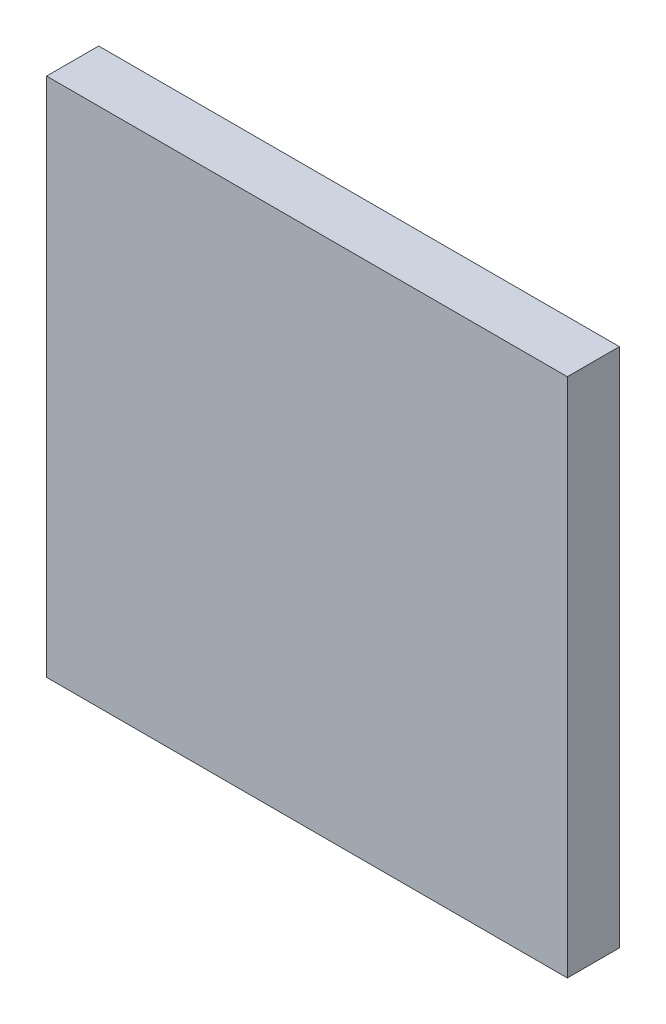
ISO-10303-21;
HEADER;
FILE_DESCRIPTION(('STEP AP214'),'2;1');
FILE_NAME('part.step','',(''),(''),'','','');
FILE_SCHEMA(('AUTOMOTIVE_DESIGN { 1 0 10303 214 1 1 1 1 }'));
ENDSEC;
DATA;
#1=APPLICATION_CONTEXT('core data for automotive mechanical design processes');
#2=APPLICATION_PROTOCOL_DEFINITION('international standard','automotive_design',2000,#1);
#3=PRODUCT_CONTEXT('',#1,'mechanical');
#4=PRODUCT('Part','Part','',(#3));
#5=PRODUCT_RELATED_PRODUCT_CATEGORY('part','',(#4));
#6=PRODUCT_DEFINITION_FORMATION('','',#4);
#7=PRODUCT_DEFINITION_CONTEXT('part definition',#1,'design');
#8=PRODUCT_DEFINITION('design','',#6,#7);
#9=PRODUCT_DEFINITION_SHAPE('','',#8);
#10=(LENGTH_UNIT() NAMED_UNIT(*) SI_UNIT(.MILLI.,.METRE.));
#11=(NAMED_UNIT(*) PLANE_ANGLE_UNIT() SI_UNIT($,.RADIAN.));
#12=(NAMED_UNIT(*) SI_UNIT($,.STERADIAN.) SOLID_ANGLE_UNIT());
#13=UNCERTAINTY_MEASURE_WITH_UNIT(LENGTH_MEASURE(1.E-05),#10,'distance_accuracy_value','');
#14=(GEOMETRIC_REPRESENTATION_CONTEXT(3) GLOBAL_UNCERTAINTY_ASSIGNED_CONTEXT((#13)) GLOBAL_UNIT_ASSIGNED_CONTEXT((#10,
#11,#12)) REPRESENTATION_CONTEXT('',''));
#15=CARTESIAN_POINT('',(0.,0.,0.));
#16=DIRECTION('',(0.,0.,1.));
#17=DIRECTION('',(1.,0.,0.));
#18=AXIS2_PLACEMENT_3D('',#15,#16,#17);
#19=CARTESIAN_POINT('',(0.,0.,10.));
#20=DIRECTION('',(1.,0.,0.));
#21=DIRECTION('',(0.,0.,-1.));
#22=AXIS2_PLACEMENT_3D('',#19,#20,#21);
#23=PLANE('',#22);
#24=DIRECTION('',(0.,-1.,0.));
#25=VECTOR('',#24,1.);
#26=CARTESIAN_POINT('',(0.,0.,0.));
#27=LINE('',#26,#25);
#28=CARTESIAN_POINT('',(0.,100.,0.));
#29=VERTEX_POINT('',#28);
#30=CARTESIAN_POINT('',(0.,0.,0.));
#31=VERTEX_POINT('',#30);
#32=EDGE_CURVE('E100',#29,#31,#27,.T.);
#33=ORIENTED_EDGE('',*,*,#32,.T.);
#34=DIRECTION('',(0.,0.,-1.));
#35=VECTOR('',#34,1.);
#36=CARTESIAN_POINT('',(0.,0.,10.));
#37=LINE('',#36,#35);
#38=CARTESIAN_POINT('',(0.,0.,10.));
#39=VERTEX_POINT('',#38);
#40=EDGE_CURVE('E11',#39,#31,#37,.T.);
#41=ORIENTED_EDGE('',*,*,#40,.F.);
#42=DIRECTION('',(0.,-1.,0.));
#43=VECTOR('',#42,1.);
#44=CARTESIAN_POINT('',(0.,0.,10.));
#45=LINE('',#44,#43);
#46=CARTESIAN_POINT('',(0.,100.,10.));
#47=VERTEX_POINT('',#46);
#48=EDGE_CURVE('E88',#47,#39,#45,.T.);
#49=ORIENTED_EDGE('',*,*,#48,.F.);
#50=DIRECTION('',(0.,0.,-1.));
#51=VECTOR('',#50,1.);
#52=CARTESIAN_POINT('',(0.,100.,10.));
#53=LINE('',#52,#51);
#54=EDGE_CURVE('E96',#47,#29,#53,.T.);
#55=ORIENTED_EDGE('',*,*,#54,.T.);
#56=EDGE_LOOP('',(#33,#41,#49,#55));
#57=FACE_BOUND('',#56,.T.);
#58=ADVANCED_FACE('F37',(#57),#23,.F.);
#59=CARTESIAN_POINT('',(0.,0.,10.));
#60=DIRECTION('',(0.,1.,0.));
#61=DIRECTION('',(0.,0.,1.));
#62=AXIS2_PLACEMENT_3D('',#59,#60,#61);
#63=PLANE('',#62);
#64=DIRECTION('',(1.,0.,0.));
#65=VECTOR('',#64,1.);
#66=CARTESIAN_POINT('',(0.,0.,0.));
#67=LINE('',#66,#65);
#68=CARTESIAN_POINT('',(100.,0.,0.));
#69=VERTEX_POINT('',#68);
#70=EDGE_CURVE('E92',#31,#69,#67,.T.);
#71=ORIENTED_EDGE('',*,*,#70,.T.);
#72=DIRECTION('',(0.,0.,-1.));
#73=VECTOR('',#72,1.);
#74=CARTESIAN_POINT('',(100.,0.,10.));
#75=LINE('',#74,#73);
#76=CARTESIAN_POINT('',(100.,0.,10.));
#77=VERTEX_POINT('',#76);
#78=EDGE_CURVE('E45',#77,#69,#75,.T.);
#79=ORIENTED_EDGE('',*,*,#78,.F.);
#80=DIRECTION('',(1.,0.,0.));
#81=VECTOR('',#80,1.);
#82=CARTESIAN_POINT('',(0.,0.,10.));
#83=LINE('',#82,#81);
#84=EDGE_CURVE('E83',#39,#77,#83,.T.);
#85=ORIENTED_EDGE('',*,*,#84,.F.);
#86=ORIENTED_EDGE('',*,*,#40,.T.);
#87=EDGE_LOOP('',(#71,#79,#85,#86));
#88=FACE_BOUND('',#87,.T.);
#89=ADVANCED_FACE('F91',(#88),#63,.F.);
#90=CARTESIAN_POINT('',(100.,0.,10.));
#91=DIRECTION('',(-1.,0.,0.));
#92=DIRECTION('',(0.,0.,1.));
#93=AXIS2_PLACEMENT_3D('',#90,#91,#92);
#94=PLANE('',#93);
#95=DIRECTION('',(0.,1.,0.));
#96=VECTOR('',#95,1.);
#97=CARTESIAN_POINT('',(100.,0.,0.));
#98=LINE('',#97,#96);
#99=CARTESIAN_POINT('',(100.,100.,0.));
#100=VERTEX_POINT('',#99);
#101=EDGE_CURVE('E70',#69,#100,#98,.T.);
#102=ORIENTED_EDGE('',*,*,#101,.T.);
#103=DIRECTION('',(0.,0.,-1.));
#104=VECTOR('',#103,1.);
#105=CARTESIAN_POINT('',(100.,100.,10.));
#106=LINE('',#105,#104);
#107=CARTESIAN_POINT('',(100.,100.,10.));
#108=VERTEX_POINT('',#107);
#109=EDGE_CURVE('E93',#108,#100,#106,.T.);
#110=ORIENTED_EDGE('',*,*,#109,.F.);
#111=DIRECTION('',(0.,1.,0.));
#112=VECTOR('',#111,1.);
#113=CARTESIAN_POINT('',(100.,0.,10.));
#114=LINE('',#113,#112);
#115=EDGE_CURVE('E86',#77,#108,#114,.T.);
#116=ORIENTED_EDGE('',*,*,#115,.F.);
#117=ORIENTED_EDGE('',*,*,#78,.T.);
#118=EDGE_LOOP('',(#102,#110,#116,#117));
#119=FACE_BOUND('',#118,.T.);
#120=ADVANCED_FACE('F94',(#119),#94,.F.);
#121=CARTESIAN_POINT('',(0.,100.,10.));
#122=DIRECTION('',(0.,-1.,0.));
#123=DIRECTION('',(0.,0.,-1.));
#124=AXIS2_PLACEMENT_3D('',#121,#122,#123);
#125=PLANE('',#124);
#126=DIRECTION('',(-1.,0.,0.));
#127=VECTOR('',#126,1.);
#128=CARTESIAN_POINT('',(0.,100.,0.));
#129=LINE('',#128,#127);
#130=EDGE_CURVE('E76',#100,#29,#129,.T.);
#131=ORIENTED_EDGE('',*,*,#130,.T.);
#132=ORIENTED_EDGE('',*,*,#54,.F.);
#133=DIRECTION('',(-1.,0.,0.));
#134=VECTOR('',#133,1.);
#135=CARTESIAN_POINT('',(0.,100.,10.));
#136=LINE('',#135,#134);
#137=EDGE_CURVE('E53',#108,#47,#136,.T.);
#138=ORIENTED_EDGE('',*,*,#137,.F.);
#139=ORIENTED_EDGE('',*,*,#109,.T.);
#140=EDGE_LOOP('',(#131,#132,#138,#139));
#141=FACE_BOUND('',#140,.T.);
#142=ADVANCED_FACE('F107',(#141),#125,.F.);
#143=CARTESIAN_POINT('',(0.,100.,10.));
#144=DIRECTION('',(0.,0.,-1.));
#145=DIRECTION('',(-1.,0.,0.));
#146=AXIS2_PLACEMENT_3D('',#143,#144,#145);
#147=PLANE('',#146);
#148=ORIENTED_EDGE('',*,*,#48,.T.);
#149=ORIENTED_EDGE('',*,*,#84,.T.);
#150=ORIENTED_EDGE('',*,*,#115,.T.);
#151=ORIENTED_EDGE('',*,*,#137,.T.);
#152=EDGE_LOOP('',(#148,#149,#150,#151));
#153=FACE_BOUND('',#152,.T.);
#154=ADVANCED_FACE('F84',(#153),#147,.F.);
#155=CARTESIAN_POINT('',(0.,100.,0.));
#156=DIRECTION('',(0.,0.,-1.));
#157=DIRECTION('',(-1.,0.,0.));
#158=AXIS2_PLACEMENT_3D('',#155,#156,#157);
#159=PLANE('',#158);
#160=ORIENTED_EDGE('',*,*,#32,.F.);
#161=ORIENTED_EDGE('',*,*,#130,.F.);
#162=ORIENTED_EDGE('',*,*,#101,.F.);
#163=ORIENTED_EDGE('',*,*,#70,.F.);
#164=EDGE_LOOP('',(#160,#161,#162,#163));
#165=FACE_BOUND('',#164,.T.);
#166=ADVANCED_FACE('F110',(#165),#159,.T.);
#167=CLOSED_SHELL('',(#58,#89,#120,#142,#154,#166));
#168=MANIFOLD_SOLID_BREP('B2',#167);
#169=ADVANCED_BREP_SHAPE_REPRESENTATION('',(#18,#168),#14);
#170=SHAPE_DEFINITION_REPRESENTATION(#9,#169);
ENDSEC;
END-ISO-10303-21;
